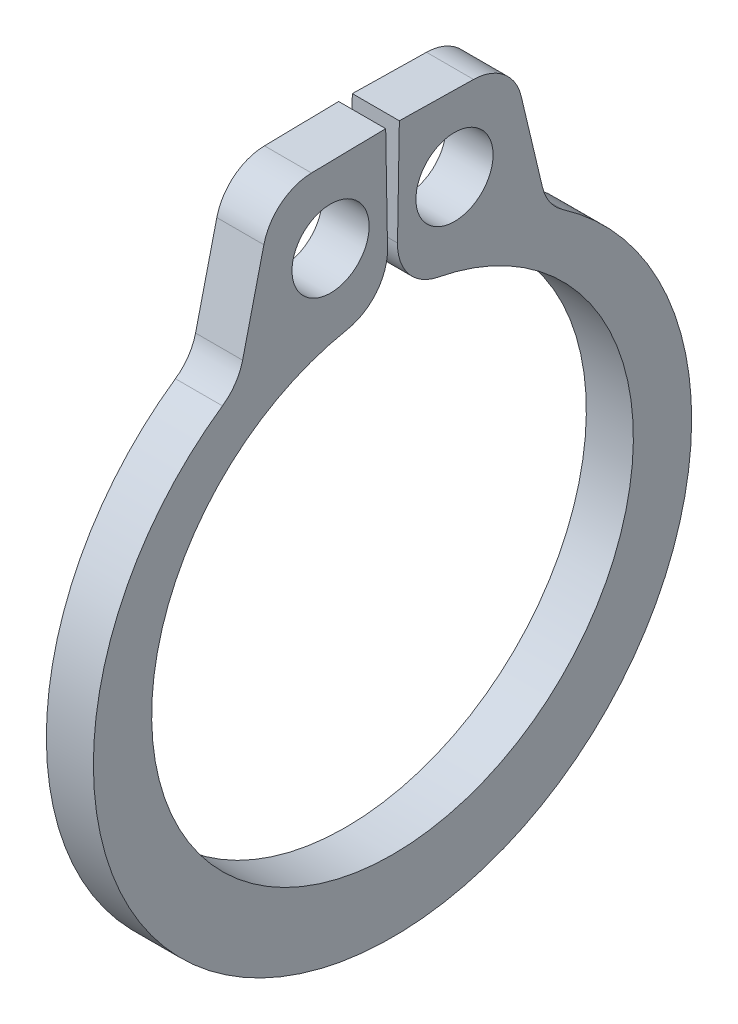
ISO-10303-21;
HEADER;
FILE_DESCRIPTION(('STEP AP214'),'2;1');
FILE_NAME('part.step','',(''),(''),'','','');
FILE_SCHEMA(('AUTOMOTIVE_DESIGN { 1 0 10303 214 1 1 1 1 }'));
ENDSEC;
DATA;
#1=APPLICATION_CONTEXT('core data for automotive mechanical design processes');
#2=APPLICATION_PROTOCOL_DEFINITION('international standard','automotive_design',2000,#1);
#3=PRODUCT_CONTEXT('',#1,'mechanical');
#4=PRODUCT('Part','Part','',(#3));
#5=PRODUCT_RELATED_PRODUCT_CATEGORY('part','',(#4));
#6=PRODUCT_DEFINITION_FORMATION('','',#4);
#7=PRODUCT_DEFINITION_CONTEXT('part definition',#1,'design');
#8=PRODUCT_DEFINITION('design','',#6,#7);
#9=PRODUCT_DEFINITION_SHAPE('','',#8);
#10=(LENGTH_UNIT() NAMED_UNIT(*) SI_UNIT(.MILLI.,.METRE.));
#11=(NAMED_UNIT(*) PLANE_ANGLE_UNIT() SI_UNIT($,.RADIAN.));
#12=(NAMED_UNIT(*) SI_UNIT($,.STERADIAN.) SOLID_ANGLE_UNIT());
#13=UNCERTAINTY_MEASURE_WITH_UNIT(LENGTH_MEASURE(1.E-05),#10,'distance_accuracy_value','');
#14=(GEOMETRIC_REPRESENTATION_CONTEXT(3) GLOBAL_UNCERTAINTY_ASSIGNED_CONTEXT((#13)) GLOBAL_UNIT_ASSIGNED_CONTEXT((#10,
#11,#12)) REPRESENTATION_CONTEXT('',''));
#15=CARTESIAN_POINT('',(0.,0.,0.));
#16=DIRECTION('',(0.,0.,1.));
#17=DIRECTION('',(1.,0.,0.));
#18=AXIS2_PLACEMENT_3D('',#15,#16,#17);
#19=CARTESIAN_POINT('',(0.3175,-0.178476991816471,0.));
#20=DIRECTION('',(1.,0.,0.));
#21=DIRECTION('',(0.,0.,-1.));
#22=AXIS2_PLACEMENT_3D('',#19,#20,#21);
#23=PLANE('',#22);
#24=CARTESIAN_POINT('',(0.3175,4.25325135106614,0.836356852458346));
#25=DIRECTION('',(1.,0.,0.));
#26=DIRECTION('',(0.,0.,-1.));
#27=AXIS2_PLACEMENT_3D('',#24,#25,#26);
#28=CIRCLE('',#27,0.5207);
#29=CARTESIAN_POINT('',(0.3175,4.25325135106614,0.315656852458346));
#30=VERTEX_POINT('',#29);
#31=EDGE_CURVE('E225',#30,#30,#28,.T.);
#32=ORIENTED_EDGE('',*,*,#31,.F.);
#33=EDGE_LOOP('',(#32));
#34=FACE_BOUND('',#33,.T.);
#35=DIRECTION('',(0.,0.972880984026505,0.231306270817762));
#36=VECTOR('',#35,1.);
#37=CARTESIAN_POINT('',(0.3175,5.25579787563983,-1.6159724411078));
#38=LINE('',#37,#36);
#39=CARTESIAN_POINT('',(0.3175,3.54136119454059,-2.02358648822072));
#40=VERTEX_POINT('',#39);
#41=CARTESIAN_POINT('',(0.3175,4.74760898824174,-1.73679634284404));
#42=VERTEX_POINT('',#41);
#43=EDGE_CURVE('E233',#40,#42,#38,.T.);
#44=ORIENTED_EDGE('',*,*,#43,.T.);
#45=CARTESIAN_POINT('',(0.3175,4.59191673735431,-1.0819501524958));
#46=DIRECTION('',(1.,0.,0.));
#47=DIRECTION('',(0.,0.,-1.));
#48=AXIS2_PLACEMENT_3D('',#45,#46,#47);
#49=CIRCLE('',#48,0.6731);
#50=CARTESIAN_POINT('',(0.3175,5.26491422096408,-1.09369736726873));
#51=VERTEX_POINT('',#50);
#52=EDGE_CURVE('E292',#42,#51,#49,.T.);
#53=ORIENTED_EDGE('',*,*,#52,.T.);
#54=DIRECTION('',(0.,0.0174524064372835,0.999847695156391));
#55=VECTOR('',#54,1.);
#56=CARTESIAN_POINT('',(0.3175,5.28239534305025,-0.0922045536894562));
#57=LINE('',#56,#55);
#58=CARTESIAN_POINT('',(0.3175,5.28239534305025,-0.0922045536894562));
#59=VERTEX_POINT('',#58);
#60=EDGE_CURVE('E237',#51,#59,#57,.T.);
#61=ORIENTED_EDGE('',*,*,#60,.T.);
#62=DIRECTION('',(0.,-0.999847695156391,0.0174524064372837));
#63=VECTOR('',#62,1.);
#64=CARTESIAN_POINT('',(0.3175,3.25070482649246,-0.0567412638088957));
#65=LINE('',#64,#63);
#66=CARTESIAN_POINT('',(0.3175,3.86555483797041,-0.0674735106803589));
#67=VERTEX_POINT('',#66);
#68=EDGE_CURVE('E194',#59,#67,#65,.T.);
#69=ORIENTED_EDGE('',*,*,#68,.T.);
#70=CARTESIAN_POINT('',(0.3175,3.85380762319748,-0.740470994290126));
#71=DIRECTION('',(1.,0.,0.));
#72=DIRECTION('',(0.,0.,-1.));
#73=AXIS2_PLACEMENT_3D('',#70,#71,#72);
#74=CIRCLE('',#73,0.6731);
#75=CARTESIAN_POINT('',(0.3175,3.19279854866846,-0.61346464251868));
#76=VERTEX_POINT('',#75);
#77=EDGE_CURVE('E289',#67,#76,#74,.T.);
#78=ORIENTED_EDGE('',*,*,#77,.T.);
#79=CARTESIAN_POINT('',(0.3175,0.,0.));
#80=DIRECTION('',(-1.,0.,0.));
#81=DIRECTION('',(0.,0.,-1.));
#82=AXIS2_PLACEMENT_3D('',#79,#80,#81);
#83=CIRCLE('',#82,3.2512);
#84=CARTESIAN_POINT('',(0.3175,3.19279854866846,0.61346464251868));
#85=VERTEX_POINT('',#84);
#86=EDGE_CURVE('E242',#76,#85,#83,.T.);
#87=ORIENTED_EDGE('',*,*,#86,.T.);
#88=CARTESIAN_POINT('',(0.3175,3.85380762319748,0.740470994290126));
#89=DIRECTION('',(1.,0.,0.));
#90=DIRECTION('',(0.,0.,-1.));
#91=AXIS2_PLACEMENT_3D('',#88,#89,#90);
#92=CIRCLE('',#91,0.6731);
#93=CARTESIAN_POINT('',(0.3175,3.86555483797041,0.0674735106803591));
#94=VERTEX_POINT('',#93);
#95=EDGE_CURVE('E286',#85,#94,#92,.T.);
#96=ORIENTED_EDGE('',*,*,#95,.T.);
#97=DIRECTION('',(0.,0.999847695156391,0.0174524064372835));
#98=VECTOR('',#97,1.);
#99=CARTESIAN_POINT('',(0.3175,3.25070482649246,0.056741263808896));
#100=LINE('',#99,#98);
#101=CARTESIAN_POINT('',(0.3175,5.28239534305025,0.0922045536894562));
#102=VERTEX_POINT('',#101);
#103=EDGE_CURVE('E246',#94,#102,#100,.T.);
#104=ORIENTED_EDGE('',*,*,#103,.T.);
#105=DIRECTION('',(0.,-0.0174524064372835,0.999847695156391));
#106=VECTOR('',#105,1.);
#107=CARTESIAN_POINT('',(0.3175,5.28239534305025,0.0922045536894562));
#108=LINE('',#107,#106);
#109=CARTESIAN_POINT('',(0.3175,5.26491422096408,1.09369736726873));
#110=VERTEX_POINT('',#109);
#111=EDGE_CURVE('E249',#102,#110,#108,.T.);
#112=ORIENTED_EDGE('',*,*,#111,.T.);
#113=CARTESIAN_POINT('',(0.3175,4.59191673735431,1.0819501524958));
#114=DIRECTION('',(1.,0.,0.));
#115=DIRECTION('',(0.,0.,-1.));
#116=AXIS2_PLACEMENT_3D('',#113,#114,#115);
#117=CIRCLE('',#116,0.6731);
#118=CARTESIAN_POINT('',(0.3175,4.74760898824174,1.73679634284404));
#119=VERTEX_POINT('',#118);
#120=EDGE_CURVE('E72',#110,#119,#117,.T.);
#121=ORIENTED_EDGE('',*,*,#120,.T.);
#122=DIRECTION('',(0.,-0.972880984026505,0.231306270817761));
#123=VECTOR('',#122,1.);
#124=CARTESIAN_POINT('',(0.3175,5.25579787563983,1.6159724411078));
#125=LINE('',#124,#123);
#126=CARTESIAN_POINT('',(0.3175,3.54136119454059,2.02358648822072));
#127=VERTEX_POINT('',#126);
#128=EDGE_CURVE('E252',#119,#127,#125,.T.);
#129=ORIENTED_EDGE('',*,*,#128,.T.);
#130=CARTESIAN_POINT('',(0.3175,3.69705344542802,2.67843267856896));
#131=DIRECTION('',(1.,0.,0.));
#132=DIRECTION('',(0.,0.,-1.));
#133=AXIS2_PLACEMENT_3D('',#130,#131,#132);
#134=CIRCLE('',#133,0.6731);
#135=CARTESIAN_POINT('',(0.3175,3.14332667891089,2.29574445293027));
#136=VERTEX_POINT('',#135);
#137=EDGE_CURVE('E11',#127,#136,#134,.F.);
#138=ORIENTED_EDGE('',*,*,#137,.T.);
#139=CARTESIAN_POINT('',(0.3175,-0.178476991816471,0.));
#140=DIRECTION('',(1.,0.,0.));
#141=DIRECTION('',(0.,0.,-1.));
#142=AXIS2_PLACEMENT_3D('',#139,#140,#141);
#143=CIRCLE('',#142,4.03792300818353);
#144=CARTESIAN_POINT('',(0.3175,3.14332667891089,-2.29574445293027));
#145=VERTEX_POINT('',#144);
#146=EDGE_CURVE('E229',#136,#145,#143,.T.);
#147=ORIENTED_EDGE('',*,*,#146,.T.);
#148=CARTESIAN_POINT('',(0.3175,3.69705344542802,-2.67843267856896));
#149=DIRECTION('',(1.,0.,0.));
#150=DIRECTION('',(0.,0.,-1.));
#151=AXIS2_PLACEMENT_3D('',#148,#149,#150);
#152=CIRCLE('',#151,0.6731);
#153=EDGE_CURVE('E321',#145,#40,#152,.F.);
#154=ORIENTED_EDGE('',*,*,#153,.T.);
#155=EDGE_LOOP('',(#44,#53,#61,#69,#78,#87,#96,#104,#112,#121,#129,#138,#147,#154));
#156=FACE_BOUND('',#155,.T.);
#157=CARTESIAN_POINT('',(0.3175,4.25325135106614,-0.836356852458346));
#158=DIRECTION('',(1.,0.,0.));
#159=DIRECTION('',(0.,0.,-1.));
#160=AXIS2_PLACEMENT_3D('',#157,#158,#159);
#161=CIRCLE('',#160,0.5207);
#162=CARTESIAN_POINT('',(0.3175,4.25325135106614,-1.35705685245835));
#163=VERTEX_POINT('',#162);
#164=EDGE_CURVE('E221',#163,#163,#161,.T.);
#165=ORIENTED_EDGE('',*,*,#164,.F.);
#166=EDGE_LOOP('',(#165));
#167=FACE_BOUND('',#166,.T.);
#168=ADVANCED_FACE('F43',(#34,#156,#167),#23,.T.);
#169=CARTESIAN_POINT('',(0.3175,-0.178476991816471,0.));
#170=DIRECTION('',(-1.,0.,0.));
#171=DIRECTION('',(0.,0.,1.));
#172=AXIS2_PLACEMENT_3D('',#169,#170,#171);
#173=CYLINDRICAL_SURFACE('',#172,4.03792300818353);
#174=CARTESIAN_POINT('',(-0.3175,-0.178476991816471,0.));
#175=DIRECTION('',(1.,0.,0.));
#176=DIRECTION('',(0.,0.,-1.));
#177=AXIS2_PLACEMENT_3D('',#174,#175,#176);
#178=CIRCLE('',#177,4.03792300818353);
#179=CARTESIAN_POINT('',(-0.3175,3.14332667891089,2.29574445293027));
#180=VERTEX_POINT('',#179);
#181=CARTESIAN_POINT('',(-0.3175,3.14332667891089,-2.29574445293027));
#182=VERTEX_POINT('',#181);
#183=EDGE_CURVE('E327',#180,#182,#178,.T.);
#184=ORIENTED_EDGE('',*,*,#183,.T.);
#185=DIRECTION('',(-1.,0.,0.));
#186=VECTOR('',#185,1.);
#187=CARTESIAN_POINT('',(0.3175,3.14332667891089,-2.29574445293027));
#188=LINE('',#187,#186);
#189=EDGE_CURVE('E268',#182,#145,#188,.F.);
#190=ORIENTED_EDGE('',*,*,#189,.T.);
#191=ORIENTED_EDGE('',*,*,#146,.F.);
#192=DIRECTION('',(-1.,0.,0.));
#193=VECTOR('',#192,1.);
#194=CARTESIAN_POINT('',(0.3175,3.14332667891089,2.29574445293027));
#195=LINE('',#194,#193);
#196=EDGE_CURVE('E264',#136,#180,#195,.T.);
#197=ORIENTED_EDGE('',*,*,#196,.T.);
#198=EDGE_LOOP('',(#184,#190,#191,#197));
#199=FACE_BOUND('',#198,.T.);
#200=ADVANCED_FACE('F337',(#199),#173,.T.);
#201=CARTESIAN_POINT('',(0.3175,5.25579787563983,-1.6159724411078));
#202=DIRECTION('',(0.,-0.231306270817762,0.972880984026505));
#203=DIRECTION('',(0.,-0.972880984026505,-0.231306270817762));
#204=AXIS2_PLACEMENT_3D('',#201,#202,#203);
#205=PLANE('',#204);
#206=ORIENTED_EDGE('',*,*,#43,.F.);
#207=DIRECTION('',(1.,0.,0.));
#208=VECTOR('',#207,1.);
#209=CARTESIAN_POINT('',(-0.3175,3.54136119454059,-2.02358648822072));
#210=LINE('',#209,#208);
#211=CARTESIAN_POINT('',(-0.3175,3.54136119454059,-2.02358648822072));
#212=VERTEX_POINT('',#211);
#213=EDGE_CURVE('E260',#40,#212,#210,.F.);
#214=ORIENTED_EDGE('',*,*,#213,.T.);
#215=DIRECTION('',(0.,0.972880984026505,0.231306270817762));
#216=VECTOR('',#215,1.);
#217=CARTESIAN_POINT('',(-0.3175,5.25579787563983,-1.6159724411078));
#218=LINE('',#217,#216);
#219=CARTESIAN_POINT('',(-0.3175,4.74760898824174,-1.73679634284404));
#220=VERTEX_POINT('',#219);
#221=EDGE_CURVE('E187',#212,#220,#218,.T.);
#222=ORIENTED_EDGE('',*,*,#221,.T.);
#223=DIRECTION('',(-1.,0.,0.));
#224=VECTOR('',#223,1.);
#225=CARTESIAN_POINT('',(0.3175,4.74760898824174,-1.73679634284404));
#226=LINE('',#225,#224);
#227=EDGE_CURVE('E196',#220,#42,#226,.F.);
#228=ORIENTED_EDGE('',*,*,#227,.T.);
#229=EDGE_LOOP('',(#206,#214,#222,#228));
#230=FACE_BOUND('',#229,.T.);
#231=ADVANCED_FACE('F345',(#230),#205,.F.);
#232=CARTESIAN_POINT('',(0.3175,5.28239534305025,-0.0922045536894562));
#233=DIRECTION('',(0.,-0.999847695156391,0.0174524064372835));
#234=DIRECTION('',(0.,-0.0174524064372835,-0.999847695156391));
#235=AXIS2_PLACEMENT_3D('',#232,#233,#234);
#236=PLANE('',#235);
#237=ORIENTED_EDGE('',*,*,#60,.F.);
#238=DIRECTION('',(-1.,0.,0.));
#239=VECTOR('',#238,1.);
#240=CARTESIAN_POINT('',(0.3175,5.26491422096408,-1.09369736726873));
#241=LINE('',#240,#239);
#242=CARTESIAN_POINT('',(-0.3175,5.26491422096408,-1.09369736726873));
#243=VERTEX_POINT('',#242);
#244=EDGE_CURVE('E182',#51,#243,#241,.T.);
#245=ORIENTED_EDGE('',*,*,#244,.T.);
#246=DIRECTION('',(0.,0.0174524064372835,0.999847695156391));
#247=VECTOR('',#246,1.);
#248=CARTESIAN_POINT('',(-0.3175,5.28239534305025,-0.0922045536894562));
#249=LINE('',#248,#247);
#250=CARTESIAN_POINT('',(-0.3175,5.28239534305025,-0.0922045536894562));
#251=VERTEX_POINT('',#250);
#252=EDGE_CURVE('E175',#243,#251,#249,.T.);
#253=ORIENTED_EDGE('',*,*,#252,.T.);
#254=DIRECTION('',(-1.,0.,0.));
#255=VECTOR('',#254,1.);
#256=CARTESIAN_POINT('',(0.3175,5.28239534305025,-0.0922045536894562));
#257=LINE('',#256,#255);
#258=EDGE_CURVE('E179',#59,#251,#257,.T.);
#259=ORIENTED_EDGE('',*,*,#258,.F.);
#260=EDGE_LOOP('',(#237,#245,#253,#259));
#261=FACE_BOUND('',#260,.T.);
#262=ADVANCED_FACE('F178',(#261),#236,.F.);
#263=CARTESIAN_POINT('',(0.3175,3.25070482649246,-0.0567412638088957));
#264=DIRECTION('',(0.,-0.0174524064372837,-0.999847695156391));
#265=DIRECTION('',(0.,0.999847695156391,-0.0174524064372837));
#266=AXIS2_PLACEMENT_3D('',#263,#264,#265);
#267=PLANE('',#266);
#268=DIRECTION('',(0.,-0.999847695156391,0.0174524064372837));
#269=VECTOR('',#268,1.);
#270=CARTESIAN_POINT('',(-0.3175,3.25070482649246,-0.0567412638088957));
#271=LINE('',#270,#269);
#272=CARTESIAN_POINT('',(-0.3175,3.86555483797041,-0.0674735106803589));
#273=VERTEX_POINT('',#272);
#274=EDGE_CURVE('E186',#251,#273,#271,.T.);
#275=ORIENTED_EDGE('',*,*,#274,.T.);
#276=DIRECTION('',(-1.,0.,0.));
#277=VECTOR('',#276,1.);
#278=CARTESIAN_POINT('',(0.3175,3.86555483797041,-0.0674735106803589));
#279=LINE('',#278,#277);
#280=EDGE_CURVE('E302',#273,#67,#279,.F.);
#281=ORIENTED_EDGE('',*,*,#280,.T.);
#282=ORIENTED_EDGE('',*,*,#68,.F.);
#283=ORIENTED_EDGE('',*,*,#258,.T.);
#284=EDGE_LOOP('',(#275,#281,#282,#283));
#285=FACE_BOUND('',#284,.T.);
#286=ADVANCED_FACE('F191',(#285),#267,.F.);
#287=CARTESIAN_POINT('',(0.3175,0.,0.));
#288=DIRECTION('',(-1.,0.,0.));
#289=DIRECTION('',(0.,0.,1.));
#290=AXIS2_PLACEMENT_3D('',#287,#288,#289);
#291=CYLINDRICAL_SURFACE('',#290,3.2512);
#292=ORIENTED_EDGE('',*,*,#86,.F.);
#293=DIRECTION('',(-1.,0.,0.));
#294=VECTOR('',#293,1.);
#295=CARTESIAN_POINT('',(0.3175,3.19279854866846,-0.61346464251868));
#296=LINE('',#295,#294);
#297=CARTESIAN_POINT('',(-0.3175,3.19279854866846,-0.61346464251868));
#298=VERTEX_POINT('',#297);
#299=EDGE_CURVE('E298',#76,#298,#296,.T.);
#300=ORIENTED_EDGE('',*,*,#299,.T.);
#301=CARTESIAN_POINT('',(-0.3175,0.,0.));
#302=DIRECTION('',(-1.,0.,0.));
#303=DIRECTION('',(0.,0.,-1.));
#304=AXIS2_PLACEMENT_3D('',#301,#302,#303);
#305=CIRCLE('',#304,3.2512);
#306=CARTESIAN_POINT('',(-0.3175,3.19279854866846,0.61346464251868));
#307=VERTEX_POINT('',#306);
#308=EDGE_CURVE('E203',#298,#307,#305,.T.);
#309=ORIENTED_EDGE('',*,*,#308,.T.);
#310=DIRECTION('',(-1.,0.,0.));
#311=VECTOR('',#310,1.);
#312=CARTESIAN_POINT('',(0.3175,3.19279854866846,0.61346464251868));
#313=LINE('',#312,#311);
#314=EDGE_CURVE('E295',#307,#85,#313,.F.);
#315=ORIENTED_EDGE('',*,*,#314,.T.);
#316=EDGE_LOOP('',(#292,#300,#309,#315));
#317=FACE_BOUND('',#316,.T.);
#318=ADVANCED_FACE('F357',(#317),#291,.F.);
#319=CARTESIAN_POINT('',(0.3175,3.25070482649246,0.056741263808896));
#320=DIRECTION('',(0.,-0.0174524064372835,0.999847695156391));
#321=DIRECTION('',(0.,-0.999847695156391,-0.0174524064372835));
#322=AXIS2_PLACEMENT_3D('',#319,#320,#321);
#323=PLANE('',#322);
#324=ORIENTED_EDGE('',*,*,#103,.F.);
#325=DIRECTION('',(-1.,0.,0.));
#326=VECTOR('',#325,1.);
#327=CARTESIAN_POINT('',(0.3175,3.86555483797041,0.0674735106803591));
#328=LINE('',#327,#326);
#329=CARTESIAN_POINT('',(-0.3175,3.86555483797041,0.0674735106803591));
#330=VERTEX_POINT('',#329);
#331=EDGE_CURVE('E305',#94,#330,#328,.T.);
#332=ORIENTED_EDGE('',*,*,#331,.T.);
#333=DIRECTION('',(0.,0.999847695156391,0.0174524064372835));
#334=VECTOR('',#333,1.);
#335=CARTESIAN_POINT('',(-0.3175,3.25070482649246,0.056741263808896));
#336=LINE('',#335,#334);
#337=CARTESIAN_POINT('',(-0.3175,5.28239534305025,0.0922045536894562));
#338=VERTEX_POINT('',#337);
#339=EDGE_CURVE('E209',#330,#338,#336,.T.);
#340=ORIENTED_EDGE('',*,*,#339,.T.);
#341=DIRECTION('',(-1.,0.,0.));
#342=VECTOR('',#341,1.);
#343=CARTESIAN_POINT('',(0.3175,5.28239534305025,0.0922045536894562));
#344=LINE('',#343,#342);
#345=EDGE_CURVE('E197',#102,#338,#344,.T.);
#346=ORIENTED_EDGE('',*,*,#345,.F.);
#347=EDGE_LOOP('',(#324,#332,#340,#346));
#348=FACE_BOUND('',#347,.T.);
#349=ADVANCED_FACE('F367',(#348),#323,.F.);
#350=CARTESIAN_POINT('',(0.3175,5.28239534305025,0.0922045536894562));
#351=DIRECTION('',(0.,-0.999847695156391,-0.0174524064372835));
#352=DIRECTION('',(0.,0.0174524064372835,-0.999847695156391));
#353=AXIS2_PLACEMENT_3D('',#350,#351,#352);
#354=PLANE('',#353);
#355=DIRECTION('',(0.,-0.0174524064372835,0.999847695156391));
#356=VECTOR('',#355,1.);
#357=CARTESIAN_POINT('',(-0.3175,5.28239534305025,0.0922045536894562));
#358=LINE('',#357,#356);
#359=CARTESIAN_POINT('',(-0.3175,5.26491422096408,1.09369736726873));
#360=VERTEX_POINT('',#359);
#361=EDGE_CURVE('E214',#338,#360,#358,.T.);
#362=ORIENTED_EDGE('',*,*,#361,.T.);
#363=DIRECTION('',(-1.,0.,0.));
#364=VECTOR('',#363,1.);
#365=CARTESIAN_POINT('',(0.3175,5.26491422096408,1.09369736726873));
#366=LINE('',#365,#364);
#367=EDGE_CURVE('E315',#360,#110,#366,.F.);
#368=ORIENTED_EDGE('',*,*,#367,.T.);
#369=ORIENTED_EDGE('',*,*,#111,.F.);
#370=ORIENTED_EDGE('',*,*,#345,.T.);
#371=EDGE_LOOP('',(#362,#368,#369,#370));
#372=FACE_BOUND('',#371,.T.);
#373=ADVANCED_FACE('F374',(#372),#354,.F.);
#374=CARTESIAN_POINT('',(0.3175,5.25579787563983,1.6159724411078));
#375=DIRECTION('',(0.,-0.231306270817761,-0.972880984026505));
#376=DIRECTION('',(0.,0.972880984026505,-0.231306270817762));
#377=AXIS2_PLACEMENT_3D('',#374,#375,#376);
#378=PLANE('',#377);
#379=ORIENTED_EDGE('',*,*,#128,.F.);
#380=DIRECTION('',(-1.,0.,0.));
#381=VECTOR('',#380,1.);
#382=CARTESIAN_POINT('',(0.3175,4.74760898824174,1.73679634284404));
#383=LINE('',#382,#381);
#384=CARTESIAN_POINT('',(-0.3175,4.74760898824174,1.73679634284404));
#385=VERTEX_POINT('',#384);
#386=EDGE_CURVE('E311',#119,#385,#383,.T.);
#387=ORIENTED_EDGE('',*,*,#386,.T.);
#388=DIRECTION('',(0.,-0.972880984026505,0.231306270817761));
#389=VECTOR('',#388,1.);
#390=CARTESIAN_POINT('',(-0.3175,5.25579787563983,1.6159724411078));
#391=LINE('',#390,#389);
#392=CARTESIAN_POINT('',(-0.3175,3.54136119454059,2.02358648822072));
#393=VERTEX_POINT('',#392);
#394=EDGE_CURVE('E218',#385,#393,#391,.T.);
#395=ORIENTED_EDGE('',*,*,#394,.T.);
#396=DIRECTION('',(1.,0.,0.));
#397=VECTOR('',#396,1.);
#398=CARTESIAN_POINT('',(0.3175,3.54136119454059,2.02358648822072));
#399=LINE('',#398,#397);
#400=EDGE_CURVE('E62',#393,#127,#399,.T.);
#401=ORIENTED_EDGE('',*,*,#400,.T.);
#402=EDGE_LOOP('',(#379,#387,#395,#401));
#403=FACE_BOUND('',#402,.T.);
#404=ADVANCED_FACE('F330',(#403),#378,.F.);
#405=CARTESIAN_POINT('',(0.3175,4.25325135106614,0.836356852458346));
#406=DIRECTION('',(-1.,0.,0.));
#407=DIRECTION('',(0.,0.,1.));
#408=AXIS2_PLACEMENT_3D('',#405,#406,#407);
#409=CYLINDRICAL_SURFACE('',#408,0.5207);
#410=ORIENTED_EDGE('',*,*,#31,.T.);
#411=EDGE_LOOP('',(#410));
#412=FACE_BOUND('',#411,.T.);
#413=CARTESIAN_POINT('',(-0.3175,4.25325135106614,0.836356852458346));
#414=DIRECTION('',(1.,0.,0.));
#415=DIRECTION('',(0.,0.,-1.));
#416=AXIS2_PLACEMENT_3D('',#413,#414,#415);
#417=CIRCLE('',#416,0.5207);
#418=CARTESIAN_POINT('',(-0.3175,4.25325135106614,0.315656852458346));
#419=VERTEX_POINT('',#418);
#420=EDGE_CURVE('E413',#419,#419,#417,.T.);
#421=ORIENTED_EDGE('',*,*,#420,.F.);
#422=EDGE_LOOP('',(#421));
#423=FACE_BOUND('',#422,.T.);
#424=ADVANCED_FACE('F382',(#412,#423),#409,.F.);
#425=CARTESIAN_POINT('',(0.3175,4.25325135106614,-0.836356852458346));
#426=DIRECTION('',(-1.,0.,0.));
#427=DIRECTION('',(0.,0.,1.));
#428=AXIS2_PLACEMENT_3D('',#425,#426,#427);
#429=CYLINDRICAL_SURFACE('',#428,0.5207);
#430=ORIENTED_EDGE('',*,*,#164,.T.);
#431=EDGE_LOOP('',(#430));
#432=FACE_BOUND('',#431,.T.);
#433=CARTESIAN_POINT('',(-0.3175,4.25325135106614,-0.836356852458346));
#434=DIRECTION('',(1.,0.,0.));
#435=DIRECTION('',(0.,0.,-1.));
#436=AXIS2_PLACEMENT_3D('',#433,#434,#435);
#437=CIRCLE('',#436,0.5207);
#438=CARTESIAN_POINT('',(-0.3175,4.25325135106614,-1.35705685245835));
#439=VERTEX_POINT('',#438);
#440=EDGE_CURVE('E410',#439,#439,#437,.T.);
#441=ORIENTED_EDGE('',*,*,#440,.F.);
#442=EDGE_LOOP('',(#441));
#443=FACE_BOUND('',#442,.T.);
#444=ADVANCED_FACE('F397',(#432,#443),#429,.F.);
#445=CARTESIAN_POINT('',(-0.3175,-0.178476991816471,0.));
#446=DIRECTION('',(1.,0.,0.));
#447=DIRECTION('',(0.,0.,-1.));
#448=AXIS2_PLACEMENT_3D('',#445,#446,#447);
#449=PLANE('',#448);
#450=ORIENTED_EDGE('',*,*,#440,.T.);
#451=EDGE_LOOP('',(#450));
#452=FACE_BOUND('',#451,.T.);
#453=ORIENTED_EDGE('',*,*,#420,.T.);
#454=EDGE_LOOP('',(#453));
#455=FACE_BOUND('',#454,.T.);
#456=ORIENTED_EDGE('',*,*,#252,.F.);
#457=CARTESIAN_POINT('',(-0.3175,4.59191673735431,-1.0819501524958));
#458=DIRECTION('',(1.,0.,0.));
#459=DIRECTION('',(0.,0.,-1.));
#460=AXIS2_PLACEMENT_3D('',#457,#458,#459);
#461=CIRCLE('',#460,0.6731);
#462=EDGE_CURVE('E281',#243,#220,#461,.F.);
#463=ORIENTED_EDGE('',*,*,#462,.T.);
#464=ORIENTED_EDGE('',*,*,#221,.F.);
#465=CARTESIAN_POINT('',(-0.3175,3.69705344542802,-2.67843267856896));
#466=DIRECTION('',(1.,0.,0.));
#467=DIRECTION('',(0.,0.,-1.));
#468=AXIS2_PLACEMENT_3D('',#465,#466,#467);
#469=CIRCLE('',#468,0.6731);
#470=EDGE_CURVE('E318',#212,#182,#469,.T.);
#471=ORIENTED_EDGE('',*,*,#470,.T.);
#472=ORIENTED_EDGE('',*,*,#183,.F.);
#473=CARTESIAN_POINT('',(-0.3175,3.69705344542802,2.67843267856896));
#474=DIRECTION('',(1.,0.,0.));
#475=DIRECTION('',(0.,0.,-1.));
#476=AXIS2_PLACEMENT_3D('',#473,#474,#475);
#477=CIRCLE('',#476,0.6731);
#478=EDGE_CURVE('E52',#180,#393,#477,.T.);
#479=ORIENTED_EDGE('',*,*,#478,.T.);
#480=ORIENTED_EDGE('',*,*,#394,.F.);
#481=CARTESIAN_POINT('',(-0.3175,4.59191673735431,1.0819501524958));
#482=DIRECTION('',(1.,0.,0.));
#483=DIRECTION('',(0.,0.,-1.));
#484=AXIS2_PLACEMENT_3D('',#481,#482,#483);
#485=CIRCLE('',#484,0.6731);
#486=EDGE_CURVE('E273',#385,#360,#485,.F.);
#487=ORIENTED_EDGE('',*,*,#486,.T.);
#488=ORIENTED_EDGE('',*,*,#361,.F.);
#489=ORIENTED_EDGE('',*,*,#339,.F.);
#490=CARTESIAN_POINT('',(-0.3175,3.85380762319748,0.740470994290126));
#491=DIRECTION('',(1.,0.,0.));
#492=DIRECTION('',(0.,0.,-1.));
#493=AXIS2_PLACEMENT_3D('',#490,#491,#492);
#494=CIRCLE('',#493,0.6731);
#495=EDGE_CURVE('E276',#330,#307,#494,.F.);
#496=ORIENTED_EDGE('',*,*,#495,.T.);
#497=ORIENTED_EDGE('',*,*,#308,.F.);
#498=CARTESIAN_POINT('',(-0.3175,3.85380762319748,-0.740470994290126));
#499=DIRECTION('',(1.,0.,0.));
#500=DIRECTION('',(0.,0.,-1.));
#501=AXIS2_PLACEMENT_3D('',#498,#499,#500);
#502=CIRCLE('',#501,0.6731);
#503=EDGE_CURVE('E201',#298,#273,#502,.F.);
#504=ORIENTED_EDGE('',*,*,#503,.T.);
#505=ORIENTED_EDGE('',*,*,#274,.F.);
#506=EDGE_LOOP('',(#456,#463,#464,#471,#472,#479,#480,#487,#488,#489,#496,#497,#504,#505));
#507=FACE_BOUND('',#506,.T.);
#508=ADVANCED_FACE('F199',(#452,#455,#507),#449,.F.);
#509=CARTESIAN_POINT('',(0.3175,3.69705344542802,-2.67843267856896));
#510=DIRECTION('',(-1.,0.,0.));
#511=DIRECTION('',(0.,0.,1.));
#512=AXIS2_PLACEMENT_3D('',#509,#510,#511);
#513=CYLINDRICAL_SURFACE('',#512,0.6731);
#514=ORIENTED_EDGE('',*,*,#153,.F.);
#515=ORIENTED_EDGE('',*,*,#189,.F.);
#516=ORIENTED_EDGE('',*,*,#470,.F.);
#517=ORIENTED_EDGE('',*,*,#213,.F.);
#518=EDGE_LOOP('',(#514,#515,#516,#517));
#519=FACE_BOUND('',#518,.T.);
#520=ADVANCED_FACE('F340',(#519),#513,.F.);
#521=CARTESIAN_POINT('',(0.3175,4.59191673735431,-1.0819501524958));
#522=DIRECTION('',(-1.,0.,0.));
#523=DIRECTION('',(0.,0.,1.));
#524=AXIS2_PLACEMENT_3D('',#521,#522,#523);
#525=CYLINDRICAL_SURFACE('',#524,0.6731);
#526=ORIENTED_EDGE('',*,*,#52,.F.);
#527=ORIENTED_EDGE('',*,*,#227,.F.);
#528=ORIENTED_EDGE('',*,*,#462,.F.);
#529=ORIENTED_EDGE('',*,*,#244,.F.);
#530=EDGE_LOOP('',(#526,#527,#528,#529));
#531=FACE_BOUND('',#530,.T.);
#532=ADVANCED_FACE('F350',(#531),#525,.T.);
#533=CARTESIAN_POINT('',(0.3175,3.85380762319748,-0.740470994290126));
#534=DIRECTION('',(-1.,0.,0.));
#535=DIRECTION('',(0.,0.,1.));
#536=AXIS2_PLACEMENT_3D('',#533,#534,#535);
#537=CYLINDRICAL_SURFACE('',#536,0.6731);
#538=ORIENTED_EDGE('',*,*,#77,.F.);
#539=ORIENTED_EDGE('',*,*,#280,.F.);
#540=ORIENTED_EDGE('',*,*,#503,.F.);
#541=ORIENTED_EDGE('',*,*,#299,.F.);
#542=EDGE_LOOP('',(#538,#539,#540,#541));
#543=FACE_BOUND('',#542,.T.);
#544=ADVANCED_FACE('F355',(#543),#537,.T.);
#545=CARTESIAN_POINT('',(0.3175,3.85380762319748,0.740470994290126));
#546=DIRECTION('',(-1.,0.,0.));
#547=DIRECTION('',(0.,0.,1.));
#548=AXIS2_PLACEMENT_3D('',#545,#546,#547);
#549=CYLINDRICAL_SURFACE('',#548,0.6731);
#550=ORIENTED_EDGE('',*,*,#95,.F.);
#551=ORIENTED_EDGE('',*,*,#314,.F.);
#552=ORIENTED_EDGE('',*,*,#495,.F.);
#553=ORIENTED_EDGE('',*,*,#331,.F.);
#554=EDGE_LOOP('',(#550,#551,#552,#553));
#555=FACE_BOUND('',#554,.T.);
#556=ADVANCED_FACE('F364',(#555),#549,.T.);
#557=CARTESIAN_POINT('',(0.3175,4.59191673735431,1.0819501524958));
#558=DIRECTION('',(-1.,0.,0.));
#559=DIRECTION('',(0.,0.,1.));
#560=AXIS2_PLACEMENT_3D('',#557,#558,#559);
#561=CYLINDRICAL_SURFACE('',#560,0.6731);
#562=ORIENTED_EDGE('',*,*,#120,.F.);
#563=ORIENTED_EDGE('',*,*,#367,.F.);
#564=ORIENTED_EDGE('',*,*,#486,.F.);
#565=ORIENTED_EDGE('',*,*,#386,.F.);
#566=EDGE_LOOP('',(#562,#563,#564,#565));
#567=FACE_BOUND('',#566,.T.);
#568=ADVANCED_FACE('F373',(#567),#561,.T.);
#569=CARTESIAN_POINT('',(0.3175,3.69705344542802,2.67843267856896));
#570=DIRECTION('',(-1.,0.,0.));
#571=DIRECTION('',(0.,0.,1.));
#572=AXIS2_PLACEMENT_3D('',#569,#570,#571);
#573=CYLINDRICAL_SURFACE('',#572,0.6731);
#574=ORIENTED_EDGE('',*,*,#137,.F.);
#575=ORIENTED_EDGE('',*,*,#400,.F.);
#576=ORIENTED_EDGE('',*,*,#478,.F.);
#577=ORIENTED_EDGE('',*,*,#196,.F.);
#578=EDGE_LOOP('',(#574,#575,#576,#577));
#579=FACE_BOUND('',#578,.T.);
#580=ADVANCED_FACE('F45',(#579),#573,.F.);
#581=CLOSED_SHELL('',(#168,#200,#231,#262,#286,#318,#349,#373,#404,#424,#444,#508,#520,#532,
#544,#556,#568,#580));
#582=MANIFOLD_SOLID_BREP('B2',#581);
#583=ADVANCED_BREP_SHAPE_REPRESENTATION('',(#18,#582),#14);
#584=SHAPE_DEFINITION_REPRESENTATION(#9,#583);
ENDSEC;
END-ISO-10303-21;
